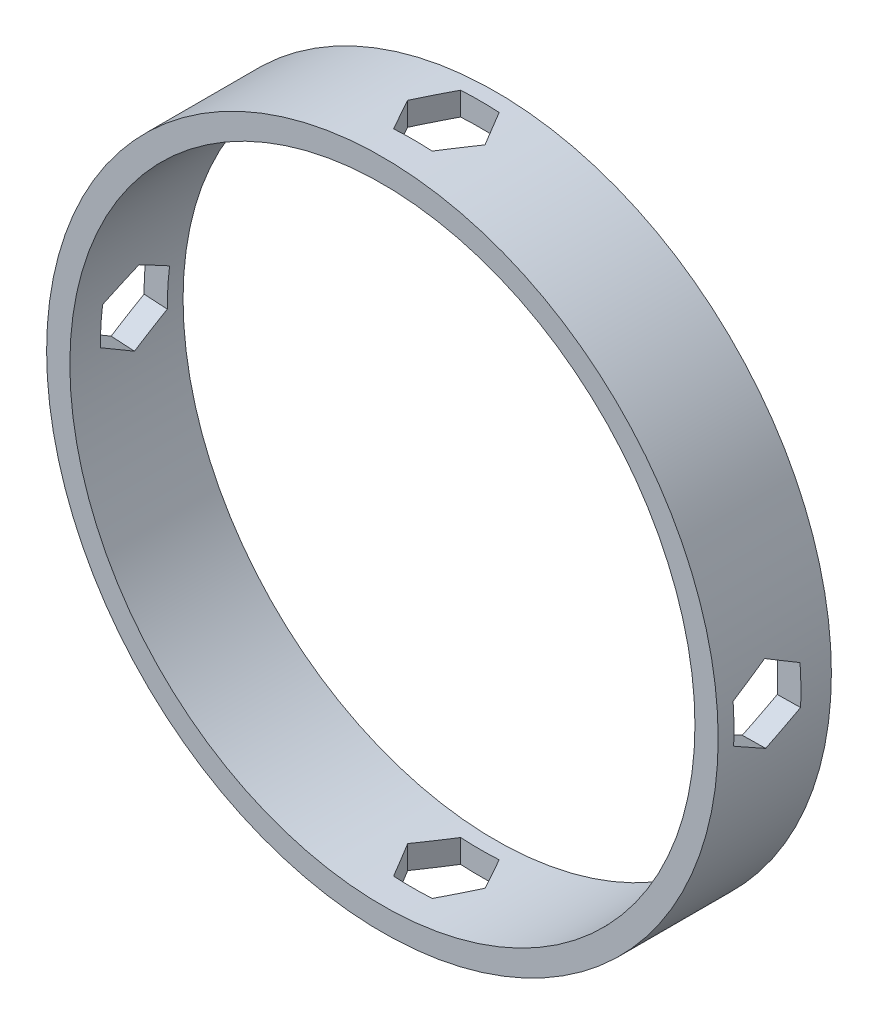
ISO-10303-21;
HEADER;
FILE_DESCRIPTION(('STEP AP214'),'2;1');
FILE_NAME('part.step','',(''),(''),'','','');
FILE_SCHEMA(('AUTOMOTIVE_DESIGN { 1 0 10303 214 1 1 1 1 }'));
ENDSEC;
DATA;
#1=APPLICATION_CONTEXT('core data for automotive mechanical design processes');
#2=APPLICATION_PROTOCOL_DEFINITION('international standard','automotive_design',2000,#1);
#3=PRODUCT_CONTEXT('',#1,'mechanical');
#4=PRODUCT('Part','Part','',(#3));
#5=PRODUCT_RELATED_PRODUCT_CATEGORY('part','',(#4));
#6=PRODUCT_DEFINITION_FORMATION('','',#4);
#7=PRODUCT_DEFINITION_CONTEXT('part definition',#1,'design');
#8=PRODUCT_DEFINITION('design','',#6,#7);
#9=PRODUCT_DEFINITION_SHAPE('','',#8);
#10=(LENGTH_UNIT() NAMED_UNIT(*) SI_UNIT(.MILLI.,.METRE.));
#11=(NAMED_UNIT(*) PLANE_ANGLE_UNIT() SI_UNIT($,.RADIAN.));
#12=(NAMED_UNIT(*) SI_UNIT($,.STERADIAN.) SOLID_ANGLE_UNIT());
#13=UNCERTAINTY_MEASURE_WITH_UNIT(LENGTH_MEASURE(1.E-05),#10,'distance_accuracy_value','');
#14=(GEOMETRIC_REPRESENTATION_CONTEXT(3) GLOBAL_UNCERTAINTY_ASSIGNED_CONTEXT((#13)) GLOBAL_UNIT_ASSIGNED_CONTEXT((#10,
#11,#12)) REPRESENTATION_CONTEXT('',''));
#15=CARTESIAN_POINT('',(0.,0.,0.));
#16=DIRECTION('',(0.,0.,1.));
#17=DIRECTION('',(1.,0.,0.));
#18=AXIS2_PLACEMENT_3D('',#15,#16,#17);
#19=CARTESIAN_POINT('',(0.,0.,11.5));
#20=DIRECTION('',(0.,0.,1.));
#21=DIRECTION('',(1.,0.,0.));
#22=AXIS2_PLACEMENT_3D('',#19,#20,#21);
#23=PLANE('',#22);
#24=CARTESIAN_POINT('',(0.,0.,11.5));
#25=DIRECTION('',(0.,0.,1.));
#26=DIRECTION('',(1.,0.,0.));
#27=AXIS2_PLACEMENT_3D('',#24,#25,#26);
#28=CIRCLE('',#27,34.11);
#29=CARTESIAN_POINT('',(34.11,0.,11.5));
#30=VERTEX_POINT('',#29);
#31=EDGE_CURVE('E287',#30,#30,#28,.T.);
#32=ORIENTED_EDGE('',*,*,#31,.T.);
#33=EDGE_LOOP('',(#32));
#34=FACE_BOUND('',#33,.T.);
#35=CARTESIAN_POINT('',(0.,0.,11.5));
#36=DIRECTION('',(0.,0.,1.));
#37=DIRECTION('',(1.,0.,0.));
#38=AXIS2_PLACEMENT_3D('',#35,#36,#37);
#39=CIRCLE('',#38,31.75);
#40=CARTESIAN_POINT('',(31.75,0.,11.5));
#41=VERTEX_POINT('',#40);
#42=EDGE_CURVE('E291',#41,#41,#39,.T.);
#43=ORIENTED_EDGE('',*,*,#42,.F.);
#44=EDGE_LOOP('',(#43));
#45=FACE_BOUND('',#44,.T.);
#46=ADVANCED_FACE('F40',(#34,#45),#23,.T.);
#47=CARTESIAN_POINT('',(0.,0.,0.));
#48=DIRECTION('',(0.,0.,1.));
#49=DIRECTION('',(1.,0.,0.));
#50=AXIS2_PLACEMENT_3D('',#47,#48,#49);
#51=PLANE('',#50);
#52=CARTESIAN_POINT('',(0.,0.,0.));
#53=DIRECTION('',(0.,0.,1.));
#54=DIRECTION('',(1.,0.,0.));
#55=AXIS2_PLACEMENT_3D('',#52,#53,#54);
#56=CIRCLE('',#55,34.11);
#57=CARTESIAN_POINT('',(34.11,0.,0.));
#58=VERTEX_POINT('',#57);
#59=EDGE_CURVE('E288',#58,#58,#56,.T.);
#60=ORIENTED_EDGE('',*,*,#59,.F.);
#61=EDGE_LOOP('',(#60));
#62=FACE_BOUND('',#61,.T.);
#63=CARTESIAN_POINT('',(0.,0.,0.));
#64=DIRECTION('',(0.,0.,1.));
#65=DIRECTION('',(1.,0.,0.));
#66=AXIS2_PLACEMENT_3D('',#63,#64,#65);
#67=CIRCLE('',#66,31.75);
#68=CARTESIAN_POINT('',(31.75,0.,0.));
#69=VERTEX_POINT('',#68);
#70=EDGE_CURVE('E294',#69,#69,#67,.T.);
#71=ORIENTED_EDGE('',*,*,#70,.T.);
#72=EDGE_LOOP('',(#71));
#73=FACE_BOUND('',#72,.T.);
#74=ADVANCED_FACE('F425',(#62,#73),#51,.F.);
#75=CARTESIAN_POINT('',(0.,0.,11.5));
#76=DIRECTION('',(0.,0.,-1.));
#77=DIRECTION('',(-1.,0.,0.));
#78=AXIS2_PLACEMENT_3D('',#75,#76,#77);
#79=CYLINDRICAL_SURFACE('',#78,34.11);
#80=CARTESIAN_POINT('',(0.,0.,-1.8));
#81=DIRECTION('',(-0.0507572780674009,-0.864536695995716,-0.5));
#82=DIRECTION('',(0.0293047281555466,0.499140494157436,-0.866025403784439));
#83=AXIS2_PLACEMENT_3D('',#80,#81,#82);
#84=ELLIPSE('',#83,68.22,34.11);
#85=CARTESIAN_POINT('',(-34.0551648875614,-1.93335058409035,5.));
#86=VERTEX_POINT('',#85);
#87=CARTESIAN_POINT('',(-34.1099807497589,0.0362388062118296,1.6));
#88=VERTEX_POINT('',#87);
#89=EDGE_CURVE('E385',#86,#88,#84,.T.);
#90=ORIENTED_EDGE('',*,*,#89,.T.);
#91=CARTESIAN_POINT('',(0.,0.,1.6));
#92=DIRECTION('',(0.,0.,-1.));
#93=DIRECTION('',(-1.,0.,0.));
#94=AXIS2_PLACEMENT_3D('',#91,#92,#93);
#95=CIRCLE('',#94,34.11);
#96=CARTESIAN_POINT('',(-33.8798810891867,3.95547182805907,1.6));
#97=VERTEX_POINT('',#96);
#98=EDGE_CURVE('E388',#88,#97,#95,.T.);
#99=ORIENTED_EDGE('',*,*,#98,.T.);
#100=CARTESIAN_POINT('',(0.,0.,-1.79999999999999));
#101=DIRECTION('',(0.0507572780674008,0.864536695995715,-0.500000000000001));
#102=DIRECTION('',(-0.0293047281555466,-0.499140494157437,-0.866025403784438));
#103=AXIS2_PLACEMENT_3D('',#100,#101,#102);
#104=ELLIPSE('',#103,68.2199999999999,34.11);
#105=CARTESIAN_POINT('',(-33.594965566417,5.90511545960414,5.));
#106=VERTEX_POINT('',#105);
#107=EDGE_CURVE('E390',#97,#106,#104,.T.);
#108=ORIENTED_EDGE('',*,*,#107,.T.);
#109=CARTESIAN_POINT('',(0.,0.,11.8));
#110=DIRECTION('',(0.0507572780674008,0.864536695995715,0.5));
#111=DIRECTION('',(0.0293047281555466,0.499140494157436,-0.866025403784438));
#112=AXIS2_PLACEMENT_3D('',#109,#110,#111);
#113=ELLIPSE('',#112,68.22,34.11);
#114=CARTESIAN_POINT('',(-33.8798810891867,3.95547182805908,8.4));
#115=VERTEX_POINT('',#114);
#116=EDGE_CURVE('E211',#106,#115,#113,.T.);
#117=ORIENTED_EDGE('',*,*,#116,.T.);
#118=CARTESIAN_POINT('',(0.,0.,8.4));
#119=DIRECTION('',(0.,0.,1.));
#120=DIRECTION('',(0.,-1.,0.));
#121=AXIS2_PLACEMENT_3D('',#118,#119,#120);
#122=CIRCLE('',#121,34.11);
#123=CARTESIAN_POINT('',(-34.1099807497589,0.0362388062118298,8.4));
#124=VERTEX_POINT('',#123);
#125=EDGE_CURVE('E380',#115,#124,#122,.T.);
#126=ORIENTED_EDGE('',*,*,#125,.T.);
#127=CARTESIAN_POINT('',(0.,0.,11.8));
#128=DIRECTION('',(-0.0507572780674008,-0.864536695995716,0.5));
#129=DIRECTION('',(-0.0293047281555466,-0.499140494157436,-0.866025403784439));
#130=AXIS2_PLACEMENT_3D('',#127,#128,#129);
#131=ELLIPSE('',#130,68.22,34.11);
#132=EDGE_CURVE('E382',#124,#86,#131,.T.);
#133=ORIENTED_EDGE('',*,*,#132,.T.);
#134=EDGE_LOOP('',(#90,#99,#108,#117,#126,#133));
#135=FACE_BOUND('',#134,.T.);
#136=CARTESIAN_POINT('',(0.,0.,-0.299999999999996));
#137=DIRECTION('',(-0.0120916028659285,0.865940987100237,-0.5));
#138=DIRECTION('',(0.00698109016957788,-0.499951262004652,-0.866025403784439));
#139=AXIS2_PLACEMENT_3D('',#136,#137,#138);
#140=ELLIPSE('',#139,68.22,34.11);
#141=CARTESIAN_POINT('',(33.8251929589518,4.3986840406737,6.5));
#142=VERTEX_POINT('',#141);
#143=CARTESIAN_POINT('',(34.0227422021873,2.43826024933765,3.1));
#144=VERTEX_POINT('',#143);
#145=EDGE_CURVE('E232',#142,#144,#140,.T.);
#146=ORIENTED_EDGE('',*,*,#145,.T.);
#147=CARTESIAN_POINT('',(0.,0.,3.1));
#148=DIRECTION('',(0.,0.,-1.));
#149=DIRECTION('',(-1.,0.,0.));
#150=AXIS2_PLACEMENT_3D('',#147,#148,#149);
#151=CIRCLE('',#150,34.11);
#152=CARTESIAN_POINT('',(34.0775574685129,-1.48733889218342,3.1));
#153=VERTEX_POINT('',#152);
#154=EDGE_CURVE('E241',#144,#153,#151,.T.);
#155=ORIENTED_EDGE('',*,*,#154,.T.);
#156=CARTESIAN_POINT('',(0.,0.,-0.299999999999989));
#157=DIRECTION('',(0.0120916028659285,-0.865940987100237,-0.500000000000001));
#158=DIRECTION('',(-0.00698109016957789,0.499951262004653,-0.866025403784438));
#159=AXIS2_PLACEMENT_3D('',#156,#157,#158);
#160=ELLIPSE('',#159,68.2199999999999,34.11);
#161=CARTESIAN_POINT('',(33.9348234916029,-3.45251424236845,6.5));
#162=VERTEX_POINT('',#161);
#163=EDGE_CURVE('E238',#153,#162,#160,.T.);
#164=ORIENTED_EDGE('',*,*,#163,.T.);
#165=CARTESIAN_POINT('',(0.,0.,13.3));
#166=DIRECTION('',(0.0120916028659285,-0.865940987100237,0.5));
#167=DIRECTION('',(0.00698109016957789,-0.499951262004652,-0.866025403784438));
#168=AXIS2_PLACEMENT_3D('',#165,#166,#167);
#169=ELLIPSE('',#168,68.22,34.11);
#170=CARTESIAN_POINT('',(34.0775574685129,-1.48733889218343,9.9));
#171=VERTEX_POINT('',#170);
#172=EDGE_CURVE('E234',#162,#171,#169,.T.);
#173=ORIENTED_EDGE('',*,*,#172,.T.);
#174=CARTESIAN_POINT('',(0.,0.,9.9));
#175=DIRECTION('',(0.,0.,1.));
#176=DIRECTION('',(0.,-1.,0.));
#177=AXIS2_PLACEMENT_3D('',#174,#175,#176);
#178=CIRCLE('',#177,34.11);
#179=CARTESIAN_POINT('',(34.0227422021873,2.43826024933765,9.9));
#180=VERTEX_POINT('',#179);
#181=EDGE_CURVE('E231',#171,#180,#178,.T.);
#182=ORIENTED_EDGE('',*,*,#181,.T.);
#183=CARTESIAN_POINT('',(0.,0.,13.3));
#184=DIRECTION('',(-0.0120916028659285,0.865940987100237,0.5));
#185=DIRECTION('',(-0.00698109016957788,0.499951262004652,-0.866025403784439));
#186=AXIS2_PLACEMENT_3D('',#183,#184,#185);
#187=ELLIPSE('',#186,68.22,34.11);
#188=EDGE_CURVE('E228',#180,#142,#187,.T.);
#189=ORIENTED_EDGE('',*,*,#188,.T.);
#190=EDGE_LOOP('',(#146,#155,#164,#173,#182,#189));
#191=FACE_BOUND('',#190,.T.);
#192=CARTESIAN_POINT('',(0.,0.,-1.79999999999999));
#193=DIRECTION('',(-0.866025403784438,0.,-0.500000000000001));
#194=DIRECTION('',(0.500000000000001,0.,-0.866025403784438));
#195=AXIS2_PLACEMENT_3D('',#192,#193,#194);
#196=ELLIPSE('',#195,68.2199999999999,34.11);
#197=CARTESIAN_POINT('',(-1.96299091524472,-34.0534692310001,1.6));
#198=VERTEX_POINT('',#197);
#199=CARTESIAN_POINT('',(-3.92598183048946,-33.8833110345885,5.00000000000001));
#200=VERTEX_POINT('',#199);
#201=EDGE_CURVE('E375',#198,#200,#196,.T.);
#202=ORIENTED_EDGE('',*,*,#201,.T.);
#203=CARTESIAN_POINT('',(0.,0.,11.8));
#204=DIRECTION('',(-0.866025403784438,0.,0.5));
#205=DIRECTION('',(-0.5,0.,-0.866025403784439));
#206=AXIS2_PLACEMENT_3D('',#203,#204,#205);
#207=ELLIPSE('',#206,68.22,34.11);
#208=CARTESIAN_POINT('',(-1.96299091524473,-34.053469231,8.4));
#209=VERTEX_POINT('',#208);
#210=EDGE_CURVE('E319',#200,#209,#207,.T.);
#211=ORIENTED_EDGE('',*,*,#210,.T.);
#212=CARTESIAN_POINT('',(0.,0.,8.4));
#213=DIRECTION('',(0.,0.,1.));
#214=DIRECTION('',(-1.,0.,0.));
#215=AXIS2_PLACEMENT_3D('',#212,#213,#214);
#216=CIRCLE('',#215,34.11);
#217=CARTESIAN_POINT('',(1.96299091524473,-34.053469231,8.4));
#218=VERTEX_POINT('',#217);
#219=EDGE_CURVE('E338',#209,#218,#216,.T.);
#220=ORIENTED_EDGE('',*,*,#219,.T.);
#221=CARTESIAN_POINT('',(0.,0.,11.8));
#222=DIRECTION('',(0.866025403784439,0.,0.5));
#223=DIRECTION('',(0.5,0.,-0.866025403784439));
#224=AXIS2_PLACEMENT_3D('',#221,#222,#223);
#225=ELLIPSE('',#224,68.22,34.11);
#226=CARTESIAN_POINT('',(3.92598183048945,-33.8833110345885,5.));
#227=VERTEX_POINT('',#226);
#228=EDGE_CURVE('E346',#218,#227,#225,.T.);
#229=ORIENTED_EDGE('',*,*,#228,.T.);
#230=CARTESIAN_POINT('',(0.,0.,-1.8));
#231=DIRECTION('',(0.866025403784439,0.,-0.5));
#232=DIRECTION('',(-0.5,0.,-0.866025403784439));
#233=AXIS2_PLACEMENT_3D('',#230,#231,#232);
#234=ELLIPSE('',#233,68.22,34.11);
#235=CARTESIAN_POINT('',(1.96299091524473,-34.053469231,1.6));
#236=VERTEX_POINT('',#235);
#237=EDGE_CURVE('E354',#227,#236,#234,.T.);
#238=ORIENTED_EDGE('',*,*,#237,.T.);
#239=CARTESIAN_POINT('',(0.,0.,1.6));
#240=DIRECTION('',(0.,0.,-1.));
#241=DIRECTION('',(1.,0.,0.));
#242=AXIS2_PLACEMENT_3D('',#239,#240,#241);
#243=CIRCLE('',#242,34.11);
#244=EDGE_CURVE('E362',#236,#198,#243,.T.);
#245=ORIENTED_EDGE('',*,*,#244,.T.);
#246=EDGE_LOOP('',(#202,#211,#220,#229,#238,#245));
#247=FACE_BOUND('',#246,.T.);
#248=CARTESIAN_POINT('',(0.,0.,-1.8));
#249=DIRECTION('',(-0.866025403784439,0.,-0.5));
#250=DIRECTION('',(0.5,0.,-0.866025403784439));
#251=AXIS2_PLACEMENT_3D('',#248,#249,#250);
#252=ELLIPSE('',#251,68.22,34.11);
#253=CARTESIAN_POINT('',(-3.92598183048945,33.8833110345885,5.));
#254=VERTEX_POINT('',#253);
#255=CARTESIAN_POINT('',(-1.96299091524473,34.053469231,1.6));
#256=VERTEX_POINT('',#255);
#257=EDGE_CURVE('E307',#254,#256,#252,.T.);
#258=ORIENTED_EDGE('',*,*,#257,.T.);
#259=CARTESIAN_POINT('',(0.,0.,1.6));
#260=DIRECTION('',(0.,0.,-1.));
#261=DIRECTION('',(-1.,0.,0.));
#262=AXIS2_PLACEMENT_3D('',#259,#260,#261);
#263=CIRCLE('',#262,34.11);
#264=CARTESIAN_POINT('',(1.96299091524472,34.0534692310001,1.6));
#265=VERTEX_POINT('',#264);
#266=EDGE_CURVE('E310',#256,#265,#263,.T.);
#267=ORIENTED_EDGE('',*,*,#266,.T.);
#268=CARTESIAN_POINT('',(0.,0.,-1.79999999999999));
#269=DIRECTION('',(0.866025403784438,0.,-0.500000000000001));
#270=DIRECTION('',(-0.500000000000001,0.,-0.866025403784438));
#271=AXIS2_PLACEMENT_3D('',#268,#269,#270);
#272=ELLIPSE('',#271,68.2199999999999,34.11);
#273=CARTESIAN_POINT('',(3.92598183048946,33.8833110345885,5.));
#274=VERTEX_POINT('',#273);
#275=EDGE_CURVE('E312',#265,#274,#272,.T.);
#276=ORIENTED_EDGE('',*,*,#275,.T.);
#277=CARTESIAN_POINT('',(0.,0.,11.8));
#278=DIRECTION('',(0.866025403784438,0.,0.5));
#279=DIRECTION('',(0.5,0.,-0.866025403784439));
#280=AXIS2_PLACEMENT_3D('',#277,#278,#279);
#281=ELLIPSE('',#280,68.22,34.11);
#282=CARTESIAN_POINT('',(1.96299091524473,34.053469231,8.4));
#283=VERTEX_POINT('',#282);
#284=EDGE_CURVE('E297',#274,#283,#281,.T.);
#285=ORIENTED_EDGE('',*,*,#284,.T.);
#286=CARTESIAN_POINT('',(0.,0.,8.4));
#287=DIRECTION('',(0.,0.,1.));
#288=DIRECTION('',(1.,0.,0.));
#289=AXIS2_PLACEMENT_3D('',#286,#287,#288);
#290=CIRCLE('',#289,34.11);
#291=CARTESIAN_POINT('',(-1.96299091524473,34.053469231,8.4));
#292=VERTEX_POINT('',#291);
#293=EDGE_CURVE('E302',#283,#292,#290,.T.);
#294=ORIENTED_EDGE('',*,*,#293,.T.);
#295=CARTESIAN_POINT('',(0.,0.,11.8));
#296=DIRECTION('',(-0.866025403784439,0.,0.5));
#297=DIRECTION('',(-0.5,0.,-0.866025403784439));
#298=AXIS2_PLACEMENT_3D('',#295,#296,#297);
#299=ELLIPSE('',#298,68.22,34.11);
#300=EDGE_CURVE('E304',#292,#254,#299,.T.);
#301=ORIENTED_EDGE('',*,*,#300,.T.);
#302=EDGE_LOOP('',(#258,#267,#276,#285,#294,#301));
#303=FACE_BOUND('',#302,.T.);
#304=ORIENTED_EDGE('',*,*,#31,.F.);
#305=EDGE_LOOP('',(#304));
#306=FACE_BOUND('',#305,.T.);
#307=ORIENTED_EDGE('',*,*,#59,.T.);
#308=EDGE_LOOP('',(#307));
#309=FACE_BOUND('',#308,.T.);
#310=ADVANCED_FACE('F403',(#135,#191,#247,#303,#306,#309),#79,.T.);
#311=CARTESIAN_POINT('',(0.,0.,11.5));
#312=DIRECTION('',(0.,0.,-1.));
#313=DIRECTION('',(-1.,0.,0.));
#314=AXIS2_PLACEMENT_3D('',#311,#312,#313);
#315=CYLINDRICAL_SURFACE('',#314,31.75);
#316=CARTESIAN_POINT('',(0.,0.,11.8));
#317=DIRECTION('',(0.0507572780674008,0.864536695995715,0.5));
#318=DIRECTION('',(0.0293047281555466,0.499140494157436,-0.866025403784438));
#319=AXIS2_PLACEMENT_3D('',#316,#317,#318);
#320=ELLIPSE('',#319,63.5,31.75);
#321=CARTESIAN_POINT('',(-31.2220759225676,5.76580220658206,5.));
#322=VERTEX_POINT('',#321);
#323=CARTESIAN_POINT('',(-31.5197354467204,3.81690678020272,8.4));
#324=VERTEX_POINT('',#323);
#325=EDGE_CURVE('E12',#322,#324,#320,.T.);
#326=ORIENTED_EDGE('',*,*,#325,.F.);
#327=CARTESIAN_POINT('',(0.,0.,-1.79999999999999));
#328=DIRECTION('',(0.0507572780674008,0.864536695995715,-0.500000000000001));
#329=DIRECTION('',(-0.0293047281555466,-0.499140494157437,-0.866025403784438));
#330=AXIS2_PLACEMENT_3D('',#327,#328,#329);
#331=ELLIPSE('',#330,63.4999999999999,31.75);
#332=CARTESIAN_POINT('',(-31.5197354467204,3.81690678020271,1.6));
#333=VERTEX_POINT('',#332);
#334=EDGE_CURVE('E198',#333,#322,#331,.T.);
#335=ORIENTED_EDGE('',*,*,#334,.F.);
#336=CARTESIAN_POINT('',(0.,0.,1.6));
#337=DIRECTION('',(0.,0.,-1.));
#338=DIRECTION('',(-1.,0.,0.));
#339=AXIS2_PLACEMENT_3D('',#336,#337,#338);
#340=CIRCLE('',#339,31.75);
#341=CARTESIAN_POINT('',(-31.7498351072926,-0.102326241644531,1.6));
#342=VERTEX_POINT('',#341);
#343=EDGE_CURVE('E203',#342,#333,#340,.T.);
#344=ORIENTED_EDGE('',*,*,#343,.F.);
#345=CARTESIAN_POINT('',(0.,0.,-1.8));
#346=DIRECTION('',(-0.0507572780674009,-0.864536695995716,-0.5));
#347=DIRECTION('',(0.0293047281555466,0.499140494157436,-0.866025403784439));
#348=AXIS2_PLACEMENT_3D('',#345,#346,#347);
#349=ELLIPSE('',#348,63.5,31.75);
#350=CARTESIAN_POINT('',(-31.682275243712,-2.07266383711243,5.));
#351=VERTEX_POINT('',#350);
#352=EDGE_CURVE('E223',#351,#342,#349,.T.);
#353=ORIENTED_EDGE('',*,*,#352,.F.);
#354=CARTESIAN_POINT('',(0.,0.,11.8));
#355=DIRECTION('',(-0.0507572780674008,-0.864536695995716,0.5));
#356=DIRECTION('',(-0.0293047281555466,-0.499140494157436,-0.866025403784439));
#357=AXIS2_PLACEMENT_3D('',#354,#355,#356);
#358=ELLIPSE('',#357,63.5,31.75);
#359=CARTESIAN_POINT('',(-31.7498351072926,-0.102326241644531,8.4));
#360=VERTEX_POINT('',#359);
#361=EDGE_CURVE('E219',#360,#351,#358,.T.);
#362=ORIENTED_EDGE('',*,*,#361,.F.);
#363=CARTESIAN_POINT('',(0.,0.,8.4));
#364=DIRECTION('',(0.,0.,1.));
#365=DIRECTION('',(0.,-1.,0.));
#366=AXIS2_PLACEMENT_3D('',#363,#364,#365);
#367=CIRCLE('',#366,31.75);
#368=EDGE_CURVE('E48',#324,#360,#367,.T.);
#369=ORIENTED_EDGE('',*,*,#368,.F.);
#370=EDGE_LOOP('',(#326,#335,#344,#353,#362,#369));
#371=FACE_BOUND('',#370,.T.);
#372=CARTESIAN_POINT('',(0.,0.,13.3));
#373=DIRECTION('',(0.0120916028659285,-0.865940987100237,0.5));
#374=DIRECTION('',(0.00698109016957789,-0.499951262004652,-0.866025403784438));
#375=AXIS2_PLACEMENT_3D('',#372,#373,#374);
#376=ELLIPSE('',#375,63.5,31.75);
#377=CARTESIAN_POINT('',(31.5580794968227,-3.48570200565368,6.5));
#378=VERTEX_POINT('',#377);
#379=CARTESIAN_POINT('',(31.7135781755533,-1.5203484150257,9.9));
#380=VERTEX_POINT('',#379);
#381=EDGE_CURVE('E204',#378,#380,#376,.T.);
#382=ORIENTED_EDGE('',*,*,#381,.F.);
#383=CARTESIAN_POINT('',(0.,0.,-0.299999999999989));
#384=DIRECTION('',(0.0120916028659285,-0.865940987100237,-0.500000000000001));
#385=DIRECTION('',(-0.00698109016957789,0.499951262004653,-0.866025403784438));
#386=AXIS2_PLACEMENT_3D('',#383,#384,#385);
#387=ELLIPSE('',#386,63.4999999999999,31.75);
#388=CARTESIAN_POINT('',(31.7135781755533,-1.52034841502569,3.1));
#389=VERTEX_POINT('',#388);
#390=EDGE_CURVE('E250',#389,#378,#387,.T.);
#391=ORIENTED_EDGE('',*,*,#390,.F.);
#392=CARTESIAN_POINT('',(0.,0.,3.1));
#393=DIRECTION('',(0.,0.,-1.));
#394=DIRECTION('',(-1.,0.,0.));
#395=AXIS2_PLACEMENT_3D('',#392,#393,#394);
#396=CIRCLE('',#395,31.75);
#397=CARTESIAN_POINT('',(31.6587629092277,2.40525072649538,3.1));
#398=VERTEX_POINT('',#397);
#399=EDGE_CURVE('E246',#398,#389,#396,.T.);
#400=ORIENTED_EDGE('',*,*,#399,.F.);
#401=CARTESIAN_POINT('',(0.,0.,-0.299999999999996));
#402=DIRECTION('',(-0.0120916028659285,0.865940987100237,-0.5));
#403=DIRECTION('',(0.00698109016957788,-0.499951262004652,-0.866025403784439));
#404=AXIS2_PLACEMENT_3D('',#401,#402,#403);
#405=ELLIPSE('',#404,63.5,31.75);
#406=CARTESIAN_POINT('',(31.4484489641716,4.36549627738847,6.5));
#407=VERTEX_POINT('',#406);
#408=EDGE_CURVE('E249',#407,#398,#405,.T.);
#409=ORIENTED_EDGE('',*,*,#408,.F.);
#410=CARTESIAN_POINT('',(0.,0.,13.3));
#411=DIRECTION('',(-0.0120916028659285,0.865940987100237,0.5));
#412=DIRECTION('',(-0.00698109016957788,0.499951262004652,-0.866025403784439));
#413=AXIS2_PLACEMENT_3D('',#410,#411,#412);
#414=ELLIPSE('',#413,63.5,31.75);
#415=CARTESIAN_POINT('',(31.6587629092277,2.40525072649538,9.9));
#416=VERTEX_POINT('',#415);
#417=EDGE_CURVE('E256',#416,#407,#414,.T.);
#418=ORIENTED_EDGE('',*,*,#417,.F.);
#419=CARTESIAN_POINT('',(0.,0.,9.9));
#420=DIRECTION('',(0.,0.,1.));
#421=DIRECTION('',(0.,-1.,0.));
#422=AXIS2_PLACEMENT_3D('',#419,#420,#421);
#423=CIRCLE('',#422,31.75);
#424=EDGE_CURVE('E254',#380,#416,#423,.T.);
#425=ORIENTED_EDGE('',*,*,#424,.F.);
#426=EDGE_LOOP('',(#382,#391,#400,#409,#418,#425));
#427=FACE_BOUND('',#426,.T.);
#428=CARTESIAN_POINT('',(0.,0.,11.8));
#429=DIRECTION('',(-0.866025403784438,0.,0.5));
#430=DIRECTION('',(-0.5,0.,-0.866025403784439));
#431=AXIS2_PLACEMENT_3D('',#428,#429,#430);
#432=ELLIPSE('',#431,63.5,31.75);
#433=CARTESIAN_POINT('',(-3.92598183048946,-31.5063353417478,5.));
#434=VERTEX_POINT('',#433);
#435=CARTESIAN_POINT('',(-1.96299091524473,-31.6892594843532,8.4));
#436=VERTEX_POINT('',#435);
#437=EDGE_CURVE('E335',#434,#436,#432,.T.);
#438=ORIENTED_EDGE('',*,*,#437,.F.);
#439=CARTESIAN_POINT('',(0.,0.,-1.79999999999999));
#440=DIRECTION('',(-0.866025403784438,0.,-0.500000000000001));
#441=DIRECTION('',(0.500000000000001,0.,-0.866025403784438));
#442=AXIS2_PLACEMENT_3D('',#439,#440,#441);
#443=ELLIPSE('',#442,63.4999999999999,31.75);
#444=CARTESIAN_POINT('',(-1.96299091524472,-31.6892594843532,1.6));
#445=VERTEX_POINT('',#444);
#446=EDGE_CURVE('E237',#445,#434,#443,.T.);
#447=ORIENTED_EDGE('',*,*,#446,.F.);
#448=CARTESIAN_POINT('',(0.,0.,1.6));
#449=DIRECTION('',(0.,0.,-1.));
#450=DIRECTION('',(1.,0.,0.));
#451=AXIS2_PLACEMENT_3D('',#448,#449,#450);
#452=CIRCLE('',#451,31.75);
#453=CARTESIAN_POINT('',(1.96299091524473,-31.6892594843532,1.6));
#454=VERTEX_POINT('',#453);
#455=EDGE_CURVE('E365',#454,#445,#452,.T.);
#456=ORIENTED_EDGE('',*,*,#455,.F.);
#457=CARTESIAN_POINT('',(0.,0.,-1.8));
#458=DIRECTION('',(0.866025403784439,0.,-0.5));
#459=DIRECTION('',(-0.5,0.,-0.866025403784439));
#460=AXIS2_PLACEMENT_3D('',#457,#458,#459);
#461=ELLIPSE('',#460,63.5,31.75);
#462=CARTESIAN_POINT('',(3.92598183048945,-31.5063353417478,5.));
#463=VERTEX_POINT('',#462);
#464=EDGE_CURVE('E357',#463,#454,#461,.T.);
#465=ORIENTED_EDGE('',*,*,#464,.F.);
#466=CARTESIAN_POINT('',(0.,0.,11.8));
#467=DIRECTION('',(0.866025403784439,0.,0.5));
#468=DIRECTION('',(0.5,0.,-0.866025403784439));
#469=AXIS2_PLACEMENT_3D('',#466,#467,#468);
#470=ELLIPSE('',#469,63.5,31.75);
#471=CARTESIAN_POINT('',(1.96299091524473,-31.6892594843532,8.4));
#472=VERTEX_POINT('',#471);
#473=EDGE_CURVE('E349',#472,#463,#470,.T.);
#474=ORIENTED_EDGE('',*,*,#473,.F.);
#475=CARTESIAN_POINT('',(0.,0.,8.4));
#476=DIRECTION('',(0.,0.,1.));
#477=DIRECTION('',(-1.,0.,0.));
#478=AXIS2_PLACEMENT_3D('',#475,#476,#477);
#479=CIRCLE('',#478,31.75);
#480=EDGE_CURVE('E341',#436,#472,#479,.T.);
#481=ORIENTED_EDGE('',*,*,#480,.F.);
#482=EDGE_LOOP('',(#438,#447,#456,#465,#474,#481));
#483=FACE_BOUND('',#482,.T.);
#484=CARTESIAN_POINT('',(0.,0.,11.8));
#485=DIRECTION('',(0.866025403784438,0.,0.5));
#486=DIRECTION('',(0.5,0.,-0.866025403784439));
#487=AXIS2_PLACEMENT_3D('',#484,#485,#486);
#488=ELLIPSE('',#487,63.5,31.75);
#489=CARTESIAN_POINT('',(3.92598183048946,31.5063353417478,5.));
#490=VERTEX_POINT('',#489);
#491=CARTESIAN_POINT('',(1.96299091524473,31.6892594843532,8.4));
#492=VERTEX_POINT('',#491);
#493=EDGE_CURVE('E252',#490,#492,#488,.T.);
#494=ORIENTED_EDGE('',*,*,#493,.F.);
#495=CARTESIAN_POINT('',(0.,0.,-1.79999999999999));
#496=DIRECTION('',(0.866025403784438,0.,-0.500000000000001));
#497=DIRECTION('',(-0.500000000000001,0.,-0.866025403784438));
#498=AXIS2_PLACEMENT_3D('',#495,#496,#497);
#499=ELLIPSE('',#498,63.4999999999999,31.75);
#500=CARTESIAN_POINT('',(1.96299091524472,31.6892594843532,1.6));
#501=VERTEX_POINT('',#500);
#502=EDGE_CURVE('E285',#501,#490,#499,.T.);
#503=ORIENTED_EDGE('',*,*,#502,.F.);
#504=CARTESIAN_POINT('',(0.,0.,1.6));
#505=DIRECTION('',(0.,0.,-1.));
#506=DIRECTION('',(-1.,0.,0.));
#507=AXIS2_PLACEMENT_3D('',#504,#505,#506);
#508=CIRCLE('',#507,31.75);
#509=CARTESIAN_POINT('',(-1.96299091524473,31.6892594843532,1.6));
#510=VERTEX_POINT('',#509);
#511=EDGE_CURVE('E282',#510,#501,#508,.T.);
#512=ORIENTED_EDGE('',*,*,#511,.F.);
#513=CARTESIAN_POINT('',(0.,0.,-1.8));
#514=DIRECTION('',(-0.866025403784439,0.,-0.5));
#515=DIRECTION('',(0.5,0.,-0.866025403784439));
#516=AXIS2_PLACEMENT_3D('',#513,#514,#515);
#517=ELLIPSE('',#516,63.5,31.75);
#518=CARTESIAN_POINT('',(-3.92598183048945,31.5063353417478,5.));
#519=VERTEX_POINT('',#518);
#520=EDGE_CURVE('E280',#519,#510,#517,.T.);
#521=ORIENTED_EDGE('',*,*,#520,.F.);
#522=CARTESIAN_POINT('',(0.,0.,11.8));
#523=DIRECTION('',(-0.866025403784439,0.,0.5));
#524=DIRECTION('',(-0.5,0.,-0.866025403784439));
#525=AXIS2_PLACEMENT_3D('',#522,#523,#524);
#526=ELLIPSE('',#525,63.5,31.75);
#527=CARTESIAN_POINT('',(-1.96299091524473,31.6892594843532,8.4));
#528=VERTEX_POINT('',#527);
#529=EDGE_CURVE('E278',#528,#519,#526,.T.);
#530=ORIENTED_EDGE('',*,*,#529,.F.);
#531=CARTESIAN_POINT('',(0.,0.,8.4));
#532=DIRECTION('',(0.,0.,1.));
#533=DIRECTION('',(1.,0.,0.));
#534=AXIS2_PLACEMENT_3D('',#531,#532,#533);
#535=CIRCLE('',#534,31.75);
#536=EDGE_CURVE('E276',#492,#528,#535,.T.);
#537=ORIENTED_EDGE('',*,*,#536,.F.);
#538=EDGE_LOOP('',(#494,#503,#512,#521,#530,#537));
#539=FACE_BOUND('',#538,.T.);
#540=ORIENTED_EDGE('',*,*,#42,.T.);
#541=EDGE_LOOP('',(#540));
#542=FACE_BOUND('',#541,.T.);
#543=ORIENTED_EDGE('',*,*,#70,.F.);
#544=EDGE_LOOP('',(#543));
#545=FACE_BOUND('',#544,.T.);
#546=ADVANCED_FACE('F215',(#371,#427,#483,#539,#542,#545),#315,.F.);
#547=CARTESIAN_POINT('',(1.96299091524473,24.11,8.4));
#548=DIRECTION('',(0.866025403784438,0.,0.5));
#549=DIRECTION('',(0.5,0.,-0.866025403784439));
#550=AXIS2_PLACEMENT_3D('',#547,#548,#549);
#551=PLANE('',#550);
#552=DIRECTION('',(0.,1.,0.));
#553=VECTOR('',#552,1.);
#554=CARTESIAN_POINT('',(3.92598183048946,24.11,5.));
#555=LINE('',#554,#553);
#556=EDGE_CURVE('E316',#490,#274,#555,.T.);
#557=ORIENTED_EDGE('',*,*,#556,.F.);
#558=ORIENTED_EDGE('',*,*,#493,.T.);
#559=DIRECTION('',(0.,1.,0.));
#560=VECTOR('',#559,1.);
#561=CARTESIAN_POINT('',(1.96299091524473,24.11,8.4));
#562=LINE('',#561,#560);
#563=EDGE_CURVE('E315',#492,#283,#562,.T.);
#564=ORIENTED_EDGE('',*,*,#563,.T.);
#565=ORIENTED_EDGE('',*,*,#284,.F.);
#566=EDGE_LOOP('',(#557,#558,#564,#565));
#567=FACE_BOUND('',#566,.T.);
#568=ADVANCED_FACE('F486',(#567),#551,.F.);
#569=CARTESIAN_POINT('',(-1.96299091524473,24.11,8.4));
#570=DIRECTION('',(0.,0.,1.));
#571=DIRECTION('',(1.,0.,0.));
#572=AXIS2_PLACEMENT_3D('',#569,#570,#571);
#573=PLANE('',#572);
#574=ORIENTED_EDGE('',*,*,#563,.F.);
#575=ORIENTED_EDGE('',*,*,#536,.T.);
#576=DIRECTION('',(0.,1.,0.));
#577=VECTOR('',#576,1.);
#578=CARTESIAN_POINT('',(-1.96299091524473,24.11,8.4));
#579=LINE('',#578,#577);
#580=EDGE_CURVE('E328',#528,#292,#579,.T.);
#581=ORIENTED_EDGE('',*,*,#580,.T.);
#582=ORIENTED_EDGE('',*,*,#293,.F.);
#583=EDGE_LOOP('',(#574,#575,#581,#582));
#584=FACE_BOUND('',#583,.T.);
#585=ADVANCED_FACE('F490',(#584),#573,.F.);
#586=CARTESIAN_POINT('',(-3.92598183048945,24.11,5.));
#587=DIRECTION('',(-0.866025403784439,0.,0.5));
#588=DIRECTION('',(0.5,0.,0.866025403784439));
#589=AXIS2_PLACEMENT_3D('',#586,#587,#588);
#590=PLANE('',#589);
#591=ORIENTED_EDGE('',*,*,#580,.F.);
#592=ORIENTED_EDGE('',*,*,#529,.T.);
#593=DIRECTION('',(0.,1.,0.));
#594=VECTOR('',#593,1.);
#595=CARTESIAN_POINT('',(-3.92598183048945,24.11,5.));
#596=LINE('',#595,#594);
#597=EDGE_CURVE('E325',#519,#254,#596,.T.);
#598=ORIENTED_EDGE('',*,*,#597,.T.);
#599=ORIENTED_EDGE('',*,*,#300,.F.);
#600=EDGE_LOOP('',(#591,#592,#598,#599));
#601=FACE_BOUND('',#600,.T.);
#602=ADVANCED_FACE('F495',(#601),#590,.F.);
#603=CARTESIAN_POINT('',(-1.96299091524473,24.11,1.6));
#604=DIRECTION('',(-0.866025403784439,0.,-0.5));
#605=DIRECTION('',(-0.5,0.,0.866025403784439));
#606=AXIS2_PLACEMENT_3D('',#603,#604,#605);
#607=PLANE('',#606);
#608=ORIENTED_EDGE('',*,*,#597,.F.);
#609=ORIENTED_EDGE('',*,*,#520,.T.);
#610=DIRECTION('',(0.,1.,0.));
#611=VECTOR('',#610,1.);
#612=CARTESIAN_POINT('',(-1.96299091524473,24.11,1.6));
#613=LINE('',#612,#611);
#614=EDGE_CURVE('E322',#510,#256,#613,.T.);
#615=ORIENTED_EDGE('',*,*,#614,.T.);
#616=ORIENTED_EDGE('',*,*,#257,.F.);
#617=EDGE_LOOP('',(#608,#609,#615,#616));
#618=FACE_BOUND('',#617,.T.);
#619=ADVANCED_FACE('F508',(#618),#607,.F.);
#620=CARTESIAN_POINT('',(1.96299091524472,24.11,1.6));
#621=DIRECTION('',(0.,0.,-1.));
#622=DIRECTION('',(-1.,0.,0.));
#623=AXIS2_PLACEMENT_3D('',#620,#621,#622);
#624=PLANE('',#623);
#625=ORIENTED_EDGE('',*,*,#614,.F.);
#626=ORIENTED_EDGE('',*,*,#511,.T.);
#627=DIRECTION('',(0.,1.,0.));
#628=VECTOR('',#627,1.);
#629=CARTESIAN_POINT('',(1.96299091524472,24.11,1.6));
#630=LINE('',#629,#628);
#631=EDGE_CURVE('E318',#501,#265,#630,.T.);
#632=ORIENTED_EDGE('',*,*,#631,.T.);
#633=ORIENTED_EDGE('',*,*,#266,.F.);
#634=EDGE_LOOP('',(#625,#626,#632,#633));
#635=FACE_BOUND('',#634,.T.);
#636=ADVANCED_FACE('F504',(#635),#624,.F.);
#637=CARTESIAN_POINT('',(3.92598183048946,24.11,5.));
#638=DIRECTION('',(0.866025403784438,0.,-0.500000000000001));
#639=DIRECTION('',(-0.500000000000001,0.,-0.866025403784438));
#640=AXIS2_PLACEMENT_3D('',#637,#638,#639);
#641=PLANE('',#640);
#642=ORIENTED_EDGE('',*,*,#631,.F.);
#643=ORIENTED_EDGE('',*,*,#502,.T.);
#644=ORIENTED_EDGE('',*,*,#556,.T.);
#645=ORIENTED_EDGE('',*,*,#275,.F.);
#646=EDGE_LOOP('',(#642,#643,#644,#645));
#647=FACE_BOUND('',#646,.T.);
#648=ADVANCED_FACE('F500',(#647),#641,.F.);
#649=CARTESIAN_POINT('',(-1.96299091524473,-24.11,8.4));
#650=DIRECTION('',(-0.866025403784438,0.,0.5));
#651=DIRECTION('',(-0.5,0.,-0.866025403784439));
#652=AXIS2_PLACEMENT_3D('',#649,#650,#651);
#653=PLANE('',#652);
#654=DIRECTION('',(0.,-1.,0.));
#655=VECTOR('',#654,1.);
#656=CARTESIAN_POINT('',(-3.92598183048946,-24.11,5.));
#657=LINE('',#656,#655);
#658=EDGE_CURVE('E369',#434,#200,#657,.T.);
#659=ORIENTED_EDGE('',*,*,#658,.F.);
#660=ORIENTED_EDGE('',*,*,#437,.T.);
#661=DIRECTION('',(0.,-1.,0.));
#662=VECTOR('',#661,1.);
#663=CARTESIAN_POINT('',(-1.96299091524473,-24.11,8.4));
#664=LINE('',#663,#662);
#665=EDGE_CURVE('E344',#436,#209,#664,.T.);
#666=ORIENTED_EDGE('',*,*,#665,.T.);
#667=ORIENTED_EDGE('',*,*,#210,.F.);
#668=EDGE_LOOP('',(#659,#660,#666,#667));
#669=FACE_BOUND('',#668,.T.);
#670=ADVANCED_FACE('F503',(#669),#653,.F.);
#671=CARTESIAN_POINT('',(1.96299091524473,-24.11,8.4));
#672=DIRECTION('',(0.,0.,1.));
#673=DIRECTION('',(-1.,0.,0.));
#674=AXIS2_PLACEMENT_3D('',#671,#672,#673);
#675=PLANE('',#674);
#676=ORIENTED_EDGE('',*,*,#665,.F.);
#677=ORIENTED_EDGE('',*,*,#480,.T.);
#678=DIRECTION('',(0.,-1.,0.));
#679=VECTOR('',#678,1.);
#680=CARTESIAN_POINT('',(1.96299091524473,-24.11,8.4));
#681=LINE('',#680,#679);
#682=EDGE_CURVE('E352',#472,#218,#681,.T.);
#683=ORIENTED_EDGE('',*,*,#682,.T.);
#684=ORIENTED_EDGE('',*,*,#219,.F.);
#685=EDGE_LOOP('',(#676,#677,#683,#684));
#686=FACE_BOUND('',#685,.T.);
#687=ADVANCED_FACE('F518',(#686),#675,.F.);
#688=CARTESIAN_POINT('',(3.92598183048945,-24.11,5.));
#689=DIRECTION('',(0.866025403784439,0.,0.5));
#690=DIRECTION('',(-0.5,0.,0.866025403784439));
#691=AXIS2_PLACEMENT_3D('',#688,#689,#690);
#692=PLANE('',#691);
#693=ORIENTED_EDGE('',*,*,#682,.F.);
#694=ORIENTED_EDGE('',*,*,#473,.T.);
#695=DIRECTION('',(0.,-1.,0.));
#696=VECTOR('',#695,1.);
#697=CARTESIAN_POINT('',(3.92598183048945,-24.11,5.));
#698=LINE('',#697,#696);
#699=EDGE_CURVE('E360',#463,#227,#698,.T.);
#700=ORIENTED_EDGE('',*,*,#699,.T.);
#701=ORIENTED_EDGE('',*,*,#228,.F.);
#702=EDGE_LOOP('',(#693,#694,#700,#701));
#703=FACE_BOUND('',#702,.T.);
#704=ADVANCED_FACE('F522',(#703),#692,.F.);
#705=CARTESIAN_POINT('',(1.96299091524473,-24.11,1.6));
#706=DIRECTION('',(0.866025403784439,0.,-0.5));
#707=DIRECTION('',(0.5,0.,0.866025403784439));
#708=AXIS2_PLACEMENT_3D('',#705,#706,#707);
#709=PLANE('',#708);
#710=ORIENTED_EDGE('',*,*,#699,.F.);
#711=ORIENTED_EDGE('',*,*,#464,.T.);
#712=DIRECTION('',(0.,-1.,0.));
#713=VECTOR('',#712,1.);
#714=CARTESIAN_POINT('',(1.96299091524473,-24.11,1.6));
#715=LINE('',#714,#713);
#716=EDGE_CURVE('E367',#454,#236,#715,.T.);
#717=ORIENTED_EDGE('',*,*,#716,.T.);
#718=ORIENTED_EDGE('',*,*,#237,.F.);
#719=EDGE_LOOP('',(#710,#711,#717,#718));
#720=FACE_BOUND('',#719,.T.);
#721=ADVANCED_FACE('F526',(#720),#709,.F.);
#722=CARTESIAN_POINT('',(-1.96299091524472,-24.11,1.6));
#723=DIRECTION('',(0.,0.,-1.));
#724=DIRECTION('',(1.,0.,0.));
#725=AXIS2_PLACEMENT_3D('',#722,#723,#724);
#726=PLANE('',#725);
#727=ORIENTED_EDGE('',*,*,#716,.F.);
#728=ORIENTED_EDGE('',*,*,#455,.T.);
#729=DIRECTION('',(0.,-1.,0.));
#730=VECTOR('',#729,1.);
#731=CARTESIAN_POINT('',(-1.96299091524472,-24.11,1.6));
#732=LINE('',#731,#730);
#733=EDGE_CURVE('E372',#445,#198,#732,.T.);
#734=ORIENTED_EDGE('',*,*,#733,.T.);
#735=ORIENTED_EDGE('',*,*,#244,.F.);
#736=EDGE_LOOP('',(#727,#728,#734,#735));
#737=FACE_BOUND('',#736,.T.);
#738=ADVANCED_FACE('F530',(#737),#726,.F.);
#739=CARTESIAN_POINT('',(-3.92598183048946,-24.11,5.));
#740=DIRECTION('',(-0.866025403784438,0.,-0.500000000000001));
#741=DIRECTION('',(0.500000000000001,0.,-0.866025403784438));
#742=AXIS2_PLACEMENT_3D('',#739,#740,#741);
#743=PLANE('',#742);
#744=ORIENTED_EDGE('',*,*,#733,.F.);
#745=ORIENTED_EDGE('',*,*,#446,.T.);
#746=ORIENTED_EDGE('',*,*,#658,.T.);
#747=ORIENTED_EDGE('',*,*,#201,.F.);
#748=EDGE_LOOP('',(#744,#745,#746,#747));
#749=FACE_BOUND('',#748,.T.);
#750=ADVANCED_FACE('F453',(#749),#743,.F.);
#751=CARTESIAN_POINT('',(24.1350574870271,-1.6261714027835,9.9));
#752=DIRECTION('',(0.0120916028659285,-0.865940987100237,0.5));
#753=DIRECTION('',(0.,-0.500036555723539,-0.866004297298888));
#754=AXIS2_PLACEMENT_3D('',#751,#752,#753);
#755=PLANE('',#754);
#756=DIRECTION('',(0.999902524009304,0.0139621803391558,0.));
#757=VECTOR('',#756,1.);
#758=CARTESIAN_POINT('',(24.1624651201899,-3.58897097354403,6.5));
#759=LINE('',#758,#757);
#760=EDGE_CURVE('E265',#378,#162,#759,.T.);
#761=ORIENTED_EDGE('',*,*,#760,.F.);
#762=ORIENTED_EDGE('',*,*,#381,.T.);
#763=DIRECTION('',(0.999902524009304,0.0139621803391558,0.));
#764=VECTOR('',#763,1.);
#765=CARTESIAN_POINT('',(24.1350574870271,-1.6261714027835,9.9));
#766=LINE('',#765,#764);
#767=EDGE_CURVE('E242',#380,#171,#766,.T.);
#768=ORIENTED_EDGE('',*,*,#767,.T.);
#769=ORIENTED_EDGE('',*,*,#172,.F.);
#770=EDGE_LOOP('',(#761,#762,#768,#769));
#771=FACE_BOUND('',#770,.T.);
#772=ADVANCED_FACE('F451',(#771),#755,.F.);
#773=CARTESIAN_POINT('',(24.0802422207016,2.29942773873758,9.9));
#774=DIRECTION('',(0.,0.,1.));
#775=DIRECTION('',(0.,-1.,0.));
#776=AXIS2_PLACEMENT_3D('',#773,#774,#775);
#777=PLANE('',#776);
#778=ORIENTED_EDGE('',*,*,#767,.F.);
#779=ORIENTED_EDGE('',*,*,#424,.T.);
#780=DIRECTION('',(0.999902524009304,0.0139621803391558,0.));
#781=VECTOR('',#780,1.);
#782=CARTESIAN_POINT('',(24.0802422207016,2.29942773873758,9.9));
#783=LINE('',#782,#781);
#784=EDGE_CURVE('E259',#416,#180,#783,.T.);
#785=ORIENTED_EDGE('',*,*,#784,.T.);
#786=ORIENTED_EDGE('',*,*,#181,.F.);
#787=EDGE_LOOP('',(#778,#779,#785,#786));
#788=FACE_BOUND('',#787,.T.);
#789=ADVANCED_FACE('F42',(#788),#777,.F.);
#790=CARTESIAN_POINT('',(24.0528345875388,4.26222730949812,6.5));
#791=DIRECTION('',(-0.0120916028659285,0.865940987100237,0.5));
#792=DIRECTION('',(0.,-0.500036555723539,0.866004297298888));
#793=AXIS2_PLACEMENT_3D('',#790,#791,#792);
#794=PLANE('',#793);
#795=ORIENTED_EDGE('',*,*,#784,.F.);
#796=ORIENTED_EDGE('',*,*,#417,.T.);
#797=DIRECTION('',(0.999902524009304,0.0139621803391558,0.));
#798=VECTOR('',#797,1.);
#799=CARTESIAN_POINT('',(24.0528345875388,4.26222730949812,6.5));
#800=LINE('',#799,#798);
#801=EDGE_CURVE('E262',#407,#142,#800,.T.);
#802=ORIENTED_EDGE('',*,*,#801,.T.);
#803=ORIENTED_EDGE('',*,*,#188,.F.);
#804=EDGE_LOOP('',(#795,#796,#802,#803));
#805=FACE_BOUND('',#804,.T.);
#806=ADVANCED_FACE('F443',(#805),#794,.F.);
#807=CARTESIAN_POINT('',(24.0802422207016,2.29942773873758,3.1));
#808=DIRECTION('',(-0.0120916028659285,0.865940987100237,-0.5));
#809=DIRECTION('',(0.,0.500036555723539,0.866004297298888));
#810=AXIS2_PLACEMENT_3D('',#807,#808,#809);
#811=PLANE('',#810);
#812=ORIENTED_EDGE('',*,*,#801,.F.);
#813=ORIENTED_EDGE('',*,*,#408,.T.);
#814=DIRECTION('',(0.999902524009304,0.0139621803391558,0.));
#815=VECTOR('',#814,1.);
#816=CARTESIAN_POINT('',(24.0802422207016,2.29942773873758,3.1));
#817=LINE('',#816,#815);
#818=EDGE_CURVE('E270',#398,#144,#817,.T.);
#819=ORIENTED_EDGE('',*,*,#818,.T.);
#820=ORIENTED_EDGE('',*,*,#145,.F.);
#821=EDGE_LOOP('',(#812,#813,#819,#820));
#822=FACE_BOUND('',#821,.T.);
#823=ADVANCED_FACE('F439',(#822),#811,.F.);
#824=CARTESIAN_POINT('',(24.1350574870271,-1.62617140278349,3.1));
#825=DIRECTION('',(0.,0.,-1.));
#826=DIRECTION('',(-1.,0.,0.));
#827=AXIS2_PLACEMENT_3D('',#824,#825,#826);
#828=PLANE('',#827);
#829=ORIENTED_EDGE('',*,*,#818,.F.);
#830=ORIENTED_EDGE('',*,*,#399,.T.);
#831=DIRECTION('',(0.999902524009304,0.0139621803391558,0.));
#832=VECTOR('',#831,1.);
#833=CARTESIAN_POINT('',(24.1350574870271,-1.62617140278349,3.1));
#834=LINE('',#833,#832);
#835=EDGE_CURVE('E267',#389,#153,#834,.T.);
#836=ORIENTED_EDGE('',*,*,#835,.T.);
#837=ORIENTED_EDGE('',*,*,#154,.F.);
#838=EDGE_LOOP('',(#829,#830,#836,#837));
#839=FACE_BOUND('',#838,.T.);
#840=ADVANCED_FACE('F442',(#839),#828,.F.);
#841=CARTESIAN_POINT('',(24.1624651201899,-3.58897097354403,6.5));
#842=DIRECTION('',(0.0120916028659285,-0.865940987100237,-0.500000000000001));
#843=DIRECTION('',(0.,0.500036555723539,-0.866004297298888));
#844=AXIS2_PLACEMENT_3D('',#841,#842,#843);
#845=PLANE('',#844);
#846=ORIENTED_EDGE('',*,*,#835,.F.);
#847=ORIENTED_EDGE('',*,*,#390,.T.);
#848=ORIENTED_EDGE('',*,*,#760,.T.);
#849=ORIENTED_EDGE('',*,*,#163,.F.);
#850=EDGE_LOOP('',(#846,#847,#848,#849));
#851=FACE_BOUND('',#850,.T.);
#852=ADVANCED_FACE('F422',(#851),#845,.F.);
#853=CARTESIAN_POINT('',(-23.9535047979855,3.37269050258408,8.4));
#854=DIRECTION('',(0.0507572780674008,0.864536695995715,0.5));
#855=DIRECTION('',(0.,-0.500645322496128,0.865652505953023));
#856=AXIS2_PLACEMENT_3D('',#853,#854,#855);
#857=PLANE('',#856);
#858=DIRECTION('',(-0.998280988314872,0.0586094563110931,0.));
#859=VECTOR('',#858,1.);
#860=CARTESIAN_POINT('',(-23.8384549676994,5.3323070135077,5.));
#861=LINE('',#860,#859);
#862=EDGE_CURVE('E55',#322,#106,#861,.T.);
#863=ORIENTED_EDGE('',*,*,#862,.F.);
#864=ORIENTED_EDGE('',*,*,#325,.T.);
#865=DIRECTION('',(-0.998280988314872,0.0586094563110931,0.));
#866=VECTOR('',#865,1.);
#867=CARTESIAN_POINT('',(-23.9535047979855,3.37269050258408,8.4));
#868=LINE('',#867,#866);
#869=EDGE_CURVE('E391',#324,#115,#868,.T.);
#870=ORIENTED_EDGE('',*,*,#869,.T.);
#871=ORIENTED_EDGE('',*,*,#116,.F.);
#872=EDGE_LOOP('',(#863,#864,#870,#871));
#873=FACE_BOUND('',#872,.T.);
#874=ADVANCED_FACE('F207',(#873),#857,.F.);
#875=CARTESIAN_POINT('',(-24.1836044585577,-0.546542519263165,8.4));
#876=DIRECTION('',(0.,0.,1.));
#877=DIRECTION('',(0.,-1.,0.));
#878=AXIS2_PLACEMENT_3D('',#875,#876,#877);
#879=PLANE('',#878);
#880=ORIENTED_EDGE('',*,*,#869,.F.);
#881=ORIENTED_EDGE('',*,*,#368,.T.);
#882=DIRECTION('',(-0.998280988314872,0.0586094563110931,0.));
#883=VECTOR('',#882,1.);
#884=CARTESIAN_POINT('',(-24.1836044585577,-0.546542519263165,8.4));
#885=LINE('',#884,#883);
#886=EDGE_CURVE('E400',#360,#124,#885,.T.);
#887=ORIENTED_EDGE('',*,*,#886,.T.);
#888=ORIENTED_EDGE('',*,*,#125,.F.);
#889=EDGE_LOOP('',(#880,#881,#887,#888));
#890=FACE_BOUND('',#889,.T.);
#891=ADVANCED_FACE('F414',(#890),#879,.F.);
#892=CARTESIAN_POINT('',(-24.2986542888438,-2.50615903018679,5.));
#893=DIRECTION('',(-0.0507572780674008,-0.864536695995716,0.5));
#894=DIRECTION('',(0.,-0.500645322496127,-0.865652505953023));
#895=AXIS2_PLACEMENT_3D('',#892,#893,#894);
#896=PLANE('',#895);
#897=ORIENTED_EDGE('',*,*,#886,.F.);
#898=ORIENTED_EDGE('',*,*,#361,.T.);
#899=DIRECTION('',(-0.998280988314872,0.0586094563110931,0.));
#900=VECTOR('',#899,1.);
#901=CARTESIAN_POINT('',(-24.2986542888438,-2.50615903018679,5.));
#902=LINE('',#901,#900);
#903=EDGE_CURVE('E397',#351,#86,#902,.T.);
#904=ORIENTED_EDGE('',*,*,#903,.T.);
#905=ORIENTED_EDGE('',*,*,#132,.F.);
#906=EDGE_LOOP('',(#897,#898,#904,#905));
#907=FACE_BOUND('',#906,.T.);
#908=ADVANCED_FACE('F413',(#907),#896,.F.);
#909=CARTESIAN_POINT('',(-24.1836044585577,-0.546542519263166,1.6));
#910=DIRECTION('',(-0.0507572780674009,-0.864536695995716,-0.5));
#911=DIRECTION('',(0.,0.500645322496127,-0.865652505953023));
#912=AXIS2_PLACEMENT_3D('',#909,#910,#911);
#913=PLANE('',#912);
#914=ORIENTED_EDGE('',*,*,#903,.F.);
#915=ORIENTED_EDGE('',*,*,#352,.T.);
#916=DIRECTION('',(-0.998280988314872,0.0586094563110931,0.));
#917=VECTOR('',#916,1.);
#918=CARTESIAN_POINT('',(-24.1836044585577,-0.546542519263166,1.6));
#919=LINE('',#918,#917);
#920=EDGE_CURVE('E394',#342,#88,#919,.T.);
#921=ORIENTED_EDGE('',*,*,#920,.T.);
#922=ORIENTED_EDGE('',*,*,#89,.F.);
#923=EDGE_LOOP('',(#914,#915,#921,#922));
#924=FACE_BOUND('',#923,.T.);
#925=ADVANCED_FACE('F411',(#924),#913,.F.);
#926=CARTESIAN_POINT('',(-23.9535047979855,3.37269050258407,1.6));
#927=DIRECTION('',(0.,0.,-1.));
#928=DIRECTION('',(-1.,0.,0.));
#929=AXIS2_PLACEMENT_3D('',#926,#927,#928);
#930=PLANE('',#929);
#931=ORIENTED_EDGE('',*,*,#920,.F.);
#932=ORIENTED_EDGE('',*,*,#343,.T.);
#933=DIRECTION('',(-0.998280988314872,0.0586094563110931,0.));
#934=VECTOR('',#933,1.);
#935=CARTESIAN_POINT('',(-23.9535047979855,3.37269050258407,1.6));
#936=LINE('',#935,#934);
#937=EDGE_CURVE('E60',#333,#97,#936,.T.);
#938=ORIENTED_EDGE('',*,*,#937,.T.);
#939=ORIENTED_EDGE('',*,*,#98,.F.);
#940=EDGE_LOOP('',(#931,#932,#938,#939));
#941=FACE_BOUND('',#940,.T.);
#942=ADVANCED_FACE('F408',(#941),#930,.F.);
#943=CARTESIAN_POINT('',(-23.8384549676994,5.3323070135077,5.));
#944=DIRECTION('',(0.0507572780674008,0.864536695995715,-0.500000000000001));
#945=DIRECTION('',(0.,0.500645322496128,0.865652505953023));
#946=AXIS2_PLACEMENT_3D('',#943,#944,#945);
#947=PLANE('',#946);
#948=ORIENTED_EDGE('',*,*,#937,.F.);
#949=ORIENTED_EDGE('',*,*,#334,.T.);
#950=ORIENTED_EDGE('',*,*,#862,.T.);
#951=ORIENTED_EDGE('',*,*,#107,.F.);
#952=EDGE_LOOP('',(#948,#949,#950,#951));
#953=FACE_BOUND('',#952,.T.);
#954=ADVANCED_FACE('F199',(#953),#947,.F.);
#955=CLOSED_SHELL('',(#46,#74,#310,#546,#568,#585,#602,#619,#636,#648,#670,#687,#704,#721,#738,
#750,#772,#789,#806,#823,#840,#852,#874,#891,#908,#925,#942,#954));
#956=MANIFOLD_SOLID_BREP('B2',#955);
#957=ADVANCED_BREP_SHAPE_REPRESENTATION('',(#18,#956),#14);
#958=SHAPE_DEFINITION_REPRESENTATION(#9,#957);
ENDSEC;
END-ISO-10303-21;
